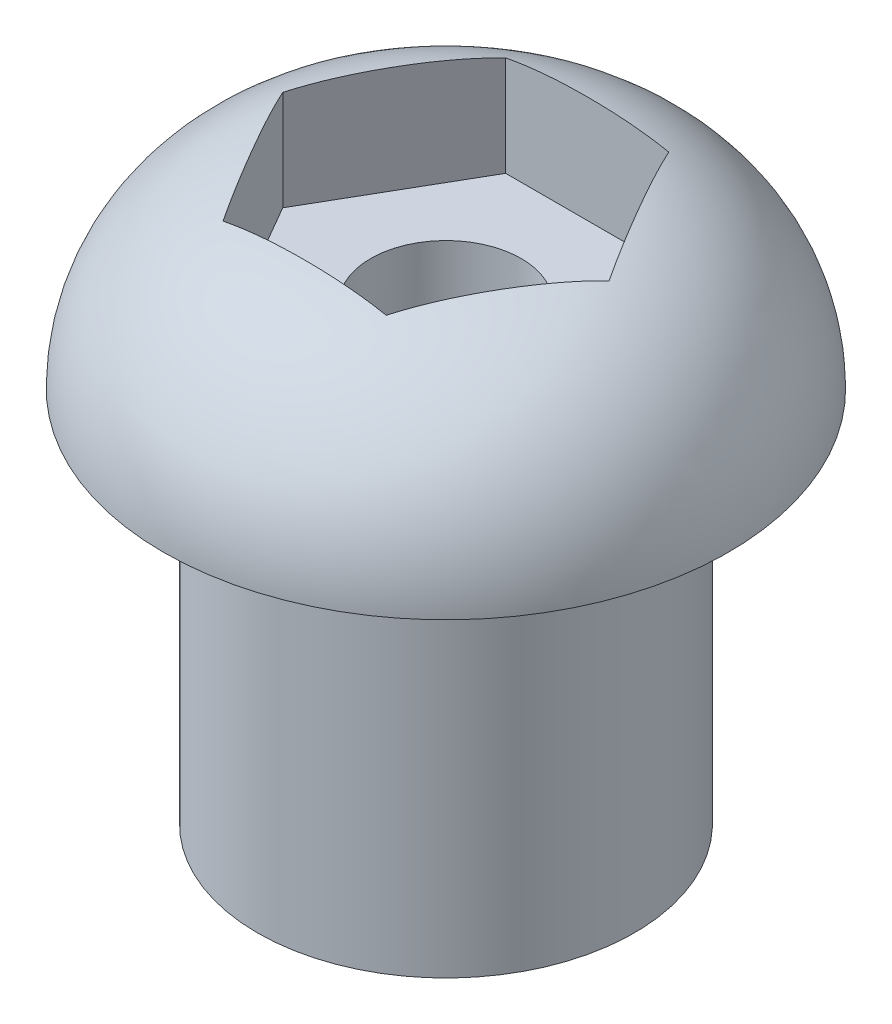
ISO-10303-21;
HEADER;
FILE_DESCRIPTION(('STEP AP214'),'2;1');
FILE_NAME('part.step','',(''),(''),'','','');
FILE_SCHEMA(('AUTOMOTIVE_DESIGN { 1 0 10303 214 1 1 1 1 }'));
ENDSEC;
DATA;
#1=APPLICATION_CONTEXT('core data for automotive mechanical design processes');
#2=APPLICATION_PROTOCOL_DEFINITION('international standard','automotive_design',2000,#1);
#3=PRODUCT_CONTEXT('',#1,'mechanical');
#4=PRODUCT('Part','Part','',(#3));
#5=PRODUCT_RELATED_PRODUCT_CATEGORY('part','',(#4));
#6=PRODUCT_DEFINITION_FORMATION('','',#4);
#7=PRODUCT_DEFINITION_CONTEXT('part definition',#1,'design');
#8=PRODUCT_DEFINITION('design','',#6,#7);
#9=PRODUCT_DEFINITION_SHAPE('','',#8);
#10=(LENGTH_UNIT() NAMED_UNIT(*) SI_UNIT(.MILLI.,.METRE.));
#11=(NAMED_UNIT(*) PLANE_ANGLE_UNIT() SI_UNIT($,.RADIAN.));
#12=(NAMED_UNIT(*) SI_UNIT($,.STERADIAN.) SOLID_ANGLE_UNIT());
#13=UNCERTAINTY_MEASURE_WITH_UNIT(LENGTH_MEASURE(1.E-05),#10,'distance_accuracy_value','');
#14=(GEOMETRIC_REPRESENTATION_CONTEXT(3) GLOBAL_UNCERTAINTY_ASSIGNED_CONTEXT((#13)) GLOBAL_UNIT_ASSIGNED_CONTEXT((#10,
#11,#12)) REPRESENTATION_CONTEXT('',''));
#15=CARTESIAN_POINT('',(0.,0.,0.));
#16=DIRECTION('',(0.,0.,1.));
#17=DIRECTION('',(1.,0.,0.));
#18=AXIS2_PLACEMENT_3D('',#15,#16,#17);
#19=CARTESIAN_POINT('',(0.,-0.00100000000000013,0.));
#20=DIRECTION('',(0.,1.,0.));
#21=DIRECTION('',(0.,0.,1.));
#22=AXIS2_PLACEMENT_3D('',#19,#20,#21);
#23=CYLINDRICAL_SURFACE('',#22,1.27);
#24=CARTESIAN_POINT('',(0.,7.62,0.));
#25=DIRECTION('',(0.,1.,0.));
#26=DIRECTION('',(0.,0.,1.));
#27=AXIS2_PLACEMENT_3D('',#24,#25,#26);
#28=CIRCLE('',#27,1.27);
#29=CARTESIAN_POINT('',(0.,7.62,1.27));
#30=VERTEX_POINT('',#29);
#31=EDGE_CURVE('E129',#30,#30,#28,.T.);
#32=ORIENTED_EDGE('',*,*,#31,.T.);
#33=EDGE_LOOP('',(#32));
#34=FACE_BOUND('',#33,.T.);
#35=CARTESIAN_POINT('',(0.,6.35,0.));
#36=DIRECTION('',(0.,-1.,0.));
#37=DIRECTION('',(0.,0.,-1.));
#38=AXIS2_PLACEMENT_3D('',#35,#36,#37);
#39=CIRCLE('',#38,1.27);
#40=CARTESIAN_POINT('',(0.,6.35,-1.27));
#41=VERTEX_POINT('',#40);
#42=EDGE_CURVE('E133',#41,#41,#39,.F.);
#43=ORIENTED_EDGE('',*,*,#42,.F.);
#44=EDGE_LOOP('',(#43));
#45=FACE_BOUND('',#44,.T.);
#46=ADVANCED_FACE('F39',(#34,#45),#23,.F.);
#47=CARTESIAN_POINT('',(0.,0.,0.));
#48=DIRECTION('',(0.,-1.,0.));
#49=DIRECTION('',(0.,0.,-1.));
#50=AXIS2_PLACEMENT_3D('',#47,#48,#49);
#51=PLANE('',#50);
#52=CARTESIAN_POINT('',(0.,0.,0.));
#53=DIRECTION('',(0.,-1.,0.));
#54=DIRECTION('',(0.,0.,-1.));
#55=AXIS2_PLACEMENT_3D('',#52,#53,#54);
#56=CIRCLE('',#55,2.3495);
#57=CARTESIAN_POINT('',(0.,0.,-2.3495));
#58=VERTEX_POINT('',#57);
#59=EDGE_CURVE('E222',#58,#58,#56,.T.);
#60=ORIENTED_EDGE('',*,*,#59,.F.);
#61=EDGE_LOOP('',(#60));
#62=FACE_BOUND('',#61,.T.);
#63=CARTESIAN_POINT('',(0.,0.,0.));
#64=DIRECTION('',(0.,1.,0.));
#65=DIRECTION('',(0.,0.,1.));
#66=AXIS2_PLACEMENT_3D('',#63,#64,#65);
#67=CIRCLE('',#66,3.175);
#68=CARTESIAN_POINT('',(0.,0.,3.175));
#69=VERTEX_POINT('',#68);
#70=EDGE_CURVE('E171',#69,#69,#67,.T.);
#71=ORIENTED_EDGE('',*,*,#70,.F.);
#72=EDGE_LOOP('',(#71));
#73=FACE_BOUND('',#72,.T.);
#74=ADVANCED_FACE('F210',(#62,#73),#51,.T.);
#75=CARTESIAN_POINT('',(0.,9.525,0.));
#76=DIRECTION('',(0.,1.,0.));
#77=DIRECTION('',(0.,0.,1.));
#78=AXIS2_PLACEMENT_3D('',#75,#76,#77);
#79=CYLINDRICAL_SURFACE('',#78,3.175);
#80=ORIENTED_EDGE('',*,*,#70,.T.);
#81=EDGE_LOOP('',(#80));
#82=FACE_BOUND('',#81,.T.);
#83=CARTESIAN_POINT('',(0.,6.35,0.));
#84=DIRECTION('',(0.,1.,0.));
#85=DIRECTION('',(0.,0.,1.));
#86=AXIS2_PLACEMENT_3D('',#83,#84,#85);
#87=CIRCLE('',#86,3.175);
#88=CARTESIAN_POINT('',(0.,6.35,3.175));
#89=VERTEX_POINT('',#88);
#90=EDGE_CURVE('E167',#89,#89,#87,.T.);
#91=ORIENTED_EDGE('',*,*,#90,.F.);
#92=EDGE_LOOP('',(#91));
#93=FACE_BOUND('',#92,.T.);
#94=ADVANCED_FACE('F207',(#82,#93),#79,.T.);
#95=CARTESIAN_POINT('',(-3.175,6.35,0.));
#96=DIRECTION('',(0.,-1.,0.));
#97=DIRECTION('',(0.,0.,-1.));
#98=AXIS2_PLACEMENT_3D('',#95,#96,#97);
#99=PLANE('',#98);
#100=ORIENTED_EDGE('',*,*,#90,.T.);
#101=EDGE_LOOP('',(#100));
#102=FACE_BOUND('',#101,.T.);
#103=CARTESIAN_POINT('',(0.,6.35,0.));
#104=DIRECTION('',(0.,1.,0.));
#105=DIRECTION('',(0.,0.,1.));
#106=AXIS2_PLACEMENT_3D('',#103,#104,#105);
#107=CIRCLE('',#106,4.7625);
#108=CARTESIAN_POINT('',(0.,6.35,4.7625));
#109=VERTEX_POINT('',#108);
#110=EDGE_CURVE('E151',#109,#109,#107,.T.);
#111=ORIENTED_EDGE('',*,*,#110,.F.);
#112=EDGE_LOOP('',(#111));
#113=FACE_BOUND('',#112,.T.);
#114=ADVANCED_FACE('F204',(#102,#113),#99,.T.);
#115=CARTESIAN_POINT('',(-2.74963065701559,7.62,0.));
#116=DIRECTION('',(-0.866025403784439,0.,0.5));
#117=DIRECTION('',(0.5,0.,0.866025403784439));
#118=AXIS2_PLACEMENT_3D('',#115,#116,#117);
#119=PLANE('',#118);
#120=DIRECTION('',(0.,1.,0.));
#121=VECTOR('',#120,1.);
#122=CARTESIAN_POINT('',(-2.74963065701559,7.62,0.));
#123=LINE('',#122,#121);
#124=CARTESIAN_POINT('',(-2.74963065701559,7.62,0.));
#125=VERTEX_POINT('',#124);
#126=CARTESIAN_POINT('',(-2.74963065701559,9.30467042764916,0.));
#127=VERTEX_POINT('',#126);
#128=EDGE_CURVE('E148',#125,#127,#123,.T.);
#129=ORIENTED_EDGE('',*,*,#128,.T.);
#130=CARTESIAN_POINT('',(-2.74963065701559,9.30467042764916,0.));
#131=CARTESIAN_POINT('',(-2.69983650051503,9.32424577853129,0.0862460089790142));
#132=CARTESIAN_POINT('',(-2.64977814172167,9.34089296862053,0.172949629752614));
#133=CARTESIAN_POINT('',(-2.54933659492492,9.36908457925064,0.346919491995405));
#134=CARTESIAN_POINT('',(-2.49895366491992,9.38063264173987,0.434185286598247));
#135=CARTESIAN_POINT('',(-2.39789827457541,9.39942332396034,0.609218357053648));
#136=CARTESIAN_POINT('',(-2.34722544477234,9.40665766638473,0.696986272835847));
#137=CARTESIAN_POINT('',(-2.24577245890099,9.41739842228163,0.872707998944596));
#138=CARTESIAN_POINT('',(-2.19499228211972,9.42090403477898,0.960661845147089));
#139=CARTESIAN_POINT('',(-2.09419234443931,9.42450669982096,1.13525245860933));
#140=CARTESIAN_POINT('',(-2.04417302673432,9.42465586299059,1.22188845823431));
#141=CARTESIAN_POINT('',(-1.94415757903064,9.42169266787663,1.39512029519882));
#142=CARTESIAN_POINT('',(-1.89416144893572,9.41858032325193,1.48171613270505));
#143=CARTESIAN_POINT('',(-1.79430030509016,9.40879452465003,1.65468070754751));
#144=CARTESIAN_POINT('',(-1.74443521344388,9.40212431222049,1.74104957980294));
#145=CARTESIAN_POINT('',(-1.64488668149314,9.38466547654602,1.91347269496051));
#146=CARTESIAN_POINT('',(-1.5952032089078,9.37387762508842,1.99952699377478));
#147=CARTESIAN_POINT('',(-1.53139418059526,9.35686849775808,2.1100474727937));
#148=CARTESIAN_POINT('',(-1.5171178733202,9.35285844231328,2.13477476233858));
#149=CARTESIAN_POINT('',(-1.48859719135471,9.34441831529121,2.18417403256932));
#150=CARTESIAN_POINT('',(-1.47435281438049,9.33998827480246,2.20884601721083));
#151=CARTESIAN_POINT('',(-1.4458692579818,9.33068007760417,2.2581809840736));
#152=CARTESIAN_POINT('',(-1.43163015549009,9.32580097848208,2.28284383304343));
#153=CARTESIAN_POINT('',(-1.40319140451912,9.3155841286895,2.33210119462895));
#154=CARTESIAN_POINT('',(-1.38899176099391,9.31024632289609,2.35669569866398));
#155=CARTESIAN_POINT('',(-1.37481532850779,9.30467042764921,2.38125));
#156=B_SPLINE_CURVE_WITH_KNOTS('',3,(#130,#131,#132,#133,#134,#135,#136,#137,#138,#139,#140,
#141,#142,#143,#144,#145,#146,#147,#148,#149,#150,#151,#152,#153,#154,#155),.UNSPECIFIED.,.F.,
.F.,(4,2,2,2,2,2,2,2,2,2,2,2,4),(0.,0.304371463013576,0.60852518185827,0.913260658234729,
1.21806158217225,1.51812699168352,1.818191144553,2.11798237694359,2.41771744570687,
2.50421378726651,2.59070373110363,2.67737951554782,2.76406573045136),.UNSPECIFIED.);
#157=CARTESIAN_POINT('',(-1.3748153285078,9.30467042764916,2.38125));
#158=VERTEX_POINT('',#157);
#159=EDGE_CURVE('E11',#127,#158,#156,.T.);
#160=ORIENTED_EDGE('',*,*,#159,.T.);
#161=DIRECTION('',(0.,1.,0.));
#162=VECTOR('',#161,1.);
#163=CARTESIAN_POINT('',(-1.3748153285078,7.62,2.38125));
#164=LINE('',#163,#162);
#165=CARTESIAN_POINT('',(-1.3748153285078,7.62,2.38125));
#166=VERTEX_POINT('',#165);
#167=EDGE_CURVE('E101',#166,#158,#164,.T.);
#168=ORIENTED_EDGE('',*,*,#167,.F.);
#169=DIRECTION('',(0.5,0.,0.866025403784439));
#170=VECTOR('',#169,1.);
#171=CARTESIAN_POINT('',(-2.74963065701559,7.62,0.));
#172=LINE('',#171,#170);
#173=EDGE_CURVE('E105',#125,#166,#172,.T.);
#174=ORIENTED_EDGE('',*,*,#173,.F.);
#175=EDGE_LOOP('',(#129,#160,#168,#174));
#176=FACE_BOUND('',#175,.T.);
#177=ADVANCED_FACE('F103',(#176),#119,.F.);
#178=CARTESIAN_POINT('',(-1.3748153285078,7.62,-2.38125));
#179=DIRECTION('',(-0.866025403784439,0.,-0.5));
#180=DIRECTION('',(-0.5,0.,0.866025403784439));
#181=AXIS2_PLACEMENT_3D('',#178,#179,#180);
#182=PLANE('',#181);
#183=DIRECTION('',(0.,1.,0.));
#184=VECTOR('',#183,1.);
#185=CARTESIAN_POINT('',(-1.3748153285078,7.62,-2.38125));
#186=LINE('',#185,#184);
#187=CARTESIAN_POINT('',(-1.3748153285078,7.62,-2.38125));
#188=VERTEX_POINT('',#187);
#189=CARTESIAN_POINT('',(-1.3748153285078,9.30467042764916,-2.38125));
#190=VERTEX_POINT('',#189);
#191=EDGE_CURVE('E152',#188,#190,#186,.T.);
#192=ORIENTED_EDGE('',*,*,#191,.T.);
#193=CARTESIAN_POINT('',(-1.3748153285078,9.30467042764916,-2.38125));
#194=CARTESIAN_POINT('',(-1.42460948500836,9.32424577853129,-2.29500399102099));
#195=CARTESIAN_POINT('',(-1.47466784380171,9.34089296862053,-2.20830037024739));
#196=CARTESIAN_POINT('',(-1.57510939059847,9.36908457925064,-2.0343305080046));
#197=CARTESIAN_POINT('',(-1.62549232060347,9.38063264173987,-1.94706471340175));
#198=CARTESIAN_POINT('',(-1.72654771094798,9.39942332396034,-1.77203164294635));
#199=CARTESIAN_POINT('',(-1.77722054075105,9.40665766638473,-1.68426372716415));
#200=CARTESIAN_POINT('',(-1.8786735266224,9.41739842228163,-1.50854200105541));
#201=CARTESIAN_POINT('',(-1.92945370340367,9.42090403477898,-1.42058815485291));
#202=CARTESIAN_POINT('',(-2.03025364108408,9.42450669982096,-1.24599754139067));
#203=CARTESIAN_POINT('',(-2.08027295878907,9.42465586299059,-1.15936154176569));
#204=CARTESIAN_POINT('',(-2.18028840649275,9.42169266787663,-0.986129704801176));
#205=CARTESIAN_POINT('',(-2.23028453658767,9.41858032325193,-0.899533867294956));
#206=CARTESIAN_POINT('',(-2.33014568043323,9.40879452465003,-0.726569292452492));
#207=CARTESIAN_POINT('',(-2.38001077207951,9.40212431222049,-0.640200420197063));
#208=CARTESIAN_POINT('',(-2.47955930403024,9.38466547654602,-0.467777305039493));
#209=CARTESIAN_POINT('',(-2.52924277661559,9.37387762508842,-0.38172300622522));
#210=CARTESIAN_POINT('',(-2.59305180492813,9.35686849775808,-0.271202527206305));
#211=CARTESIAN_POINT('',(-2.60732811220319,9.35285844231328,-0.246475237661425));
#212=CARTESIAN_POINT('',(-2.63584879416868,9.34441831529121,-0.197075967430685));
#213=CARTESIAN_POINT('',(-2.6500931711429,9.33998827480246,-0.17240398278917));
#214=CARTESIAN_POINT('',(-2.67857672754158,9.33068007760417,-0.123069015926399));
#215=CARTESIAN_POINT('',(-2.6928158300333,9.32580097848208,-0.0984061669565705));
#216=CARTESIAN_POINT('',(-2.72125458100427,9.3155841286895,-0.0491488053710482));
#217=CARTESIAN_POINT('',(-2.73545422452948,9.31024632289609,-0.0245543013360217));
#218=CARTESIAN_POINT('',(-2.7496306570156,9.30467042764921,0.));
#219=B_SPLINE_CURVE_WITH_KNOTS('',3,(#193,#194,#195,#196,#197,#198,#199,#200,#201,#202,#203,
#204,#205,#206,#207,#208,#209,#210,#211,#212,#213,#214,#215,#216,#217,#218),.UNSPECIFIED.,.F.,
.F.,(4,2,2,2,2,2,2,2,2,2,2,2,4),(0.,0.304371463013576,0.608525181858269,0.913260658234728,
1.21806158217225,1.51812699168352,1.818191144553,2.11798237694358,2.41771744570687,
2.50421378726651,2.59070373110363,2.67737951554782,2.76406573045136),.UNSPECIFIED.);
#220=EDGE_CURVE('E54',#190,#127,#219,.T.);
#221=ORIENTED_EDGE('',*,*,#220,.T.);
#222=ORIENTED_EDGE('',*,*,#128,.F.);
#223=DIRECTION('',(-0.5,0.,0.866025403784439));
#224=VECTOR('',#223,1.);
#225=CARTESIAN_POINT('',(-1.3748153285078,7.62,-2.38125));
#226=LINE('',#225,#224);
#227=EDGE_CURVE('E112',#188,#125,#226,.T.);
#228=ORIENTED_EDGE('',*,*,#227,.F.);
#229=EDGE_LOOP('',(#192,#221,#222,#228));
#230=FACE_BOUND('',#229,.T.);
#231=ADVANCED_FACE('F203',(#230),#182,.F.);
#232=CARTESIAN_POINT('',(1.3748153285078,7.62,-2.38125));
#233=DIRECTION('',(0.,0.,-1.));
#234=DIRECTION('',(-1.,0.,0.));
#235=AXIS2_PLACEMENT_3D('',#232,#233,#234);
#236=PLANE('',#235);
#237=DIRECTION('',(0.,1.,0.));
#238=VECTOR('',#237,1.);
#239=CARTESIAN_POINT('',(1.3748153285078,7.62,-2.38125));
#240=LINE('',#239,#238);
#241=CARTESIAN_POINT('',(1.3748153285078,7.62,-2.38125));
#242=VERTEX_POINT('',#241);
#243=CARTESIAN_POINT('',(1.3748153285078,9.30467042764916,-2.38125));
#244=VERTEX_POINT('',#243);
#245=EDGE_CURVE('E155',#242,#244,#240,.T.);
#246=ORIENTED_EDGE('',*,*,#245,.T.);
#247=CARTESIAN_POINT('',(1.3748153285078,9.30467042764916,-2.38125));
#248=CARTESIAN_POINT('',(1.27522701550666,9.32424577853129,-2.38125));
#249=CARTESIAN_POINT('',(1.17511029791996,9.34089296862053,-2.38125));
#250=CARTESIAN_POINT('',(0.974227204326445,9.36908457925064,-2.38125));
#251=CARTESIAN_POINT('',(0.873461344316449,9.38063264173987,-2.38125));
#252=CARTESIAN_POINT('',(0.671350563627425,9.39942332396034,-2.38125));
#253=CARTESIAN_POINT('',(0.570004904021295,9.40665766638473,-2.38125));
#254=CARTESIAN_POINT('',(0.367098932278591,9.41739842228163,-2.38125));
#255=CARTESIAN_POINT('',(0.265538578716046,9.42090403477898,-2.38125));
#256=CARTESIAN_POINT('',(0.0639387033552277,9.42450669982096,-2.38125));
#257=CARTESIAN_POINT('',(-0.0360999320547533,9.42465586299059,-2.38125));
#258=CARTESIAN_POINT('',(-0.236130827462109,9.42169266787662,-2.38125));
#259=CARTESIAN_POINT('',(-0.336123087651944,9.41858032325193,-2.38125));
#260=CARTESIAN_POINT('',(-0.535845375343076,9.40879452465003,-2.38125));
#261=CARTESIAN_POINT('',(-0.635575558635629,9.40212431222049,-2.38125));
#262=CARTESIAN_POINT('',(-0.834672622537103,9.38466547654602,-2.38125));
#263=CARTESIAN_POINT('',(-0.934039567707793,9.37387762508842,-2.38125));
#264=CARTESIAN_POINT('',(-1.06165762433287,9.35686849775808,-2.38125));
#265=CARTESIAN_POINT('',(-1.090210238883,9.35285844231328,-2.38125));
#266=CARTESIAN_POINT('',(-1.14725160281398,9.34441831529121,-2.38125));
#267=CARTESIAN_POINT('',(-1.17574035676242,9.33998827480246,-2.38125));
#268=CARTESIAN_POINT('',(-1.23270746955978,9.33068007760417,-2.38125));
#269=CARTESIAN_POINT('',(-1.26118567454321,9.32580097848208,-2.38125));
#270=CARTESIAN_POINT('',(-1.31806317648515,9.3155841286895,-2.38125));
#271=CARTESIAN_POINT('',(-1.34646246353557,9.31024632289609,-2.38125));
#272=CARTESIAN_POINT('',(-1.3748153285078,9.30467042764921,-2.38125));
#273=B_SPLINE_CURVE_WITH_KNOTS('',3,(#247,#248,#249,#250,#251,#252,#253,#254,#255,#256,#257,
#258,#259,#260,#261,#262,#263,#264,#265,#266,#267,#268,#269,#270,#271,#272),.UNSPECIFIED.,.F.,
.F.,(4,2,2,2,2,2,2,2,2,2,2,2,4),(0.,0.304371463013575,0.608525181858269,0.913260658234729,
1.21806158217225,1.51812699168352,1.818191144553,2.11798237694359,2.41771744570687,
2.50421378726651,2.59070373110363,2.67737951554782,2.76406573045136),.UNSPECIFIED.);
#274=EDGE_CURVE('E68',#244,#190,#273,.T.);
#275=ORIENTED_EDGE('',*,*,#274,.T.);
#276=ORIENTED_EDGE('',*,*,#191,.F.);
#277=DIRECTION('',(-1.,0.,0.));
#278=VECTOR('',#277,1.);
#279=CARTESIAN_POINT('',(1.3748153285078,7.62,-2.38125));
#280=LINE('',#279,#278);
#281=EDGE_CURVE('E143',#242,#188,#280,.T.);
#282=ORIENTED_EDGE('',*,*,#281,.F.);
#283=EDGE_LOOP('',(#246,#275,#276,#282));
#284=FACE_BOUND('',#283,.T.);
#285=ADVANCED_FACE('F243',(#284),#236,.F.);
#286=CARTESIAN_POINT('',(2.74963065701559,7.62,0.));
#287=DIRECTION('',(0.866025403784439,0.,-0.5));
#288=DIRECTION('',(-0.5,0.,-0.866025403784439));
#289=AXIS2_PLACEMENT_3D('',#286,#287,#288);
#290=PLANE('',#289);
#291=DIRECTION('',(0.,1.,0.));
#292=VECTOR('',#291,1.);
#293=CARTESIAN_POINT('',(2.74963065701559,7.62,0.));
#294=LINE('',#293,#292);
#295=CARTESIAN_POINT('',(2.74963065701559,7.62,0.));
#296=VERTEX_POINT('',#295);
#297=CARTESIAN_POINT('',(2.74963065701559,9.30467042764916,0.));
#298=VERTEX_POINT('',#297);
#299=EDGE_CURVE('E158',#296,#298,#294,.T.);
#300=ORIENTED_EDGE('',*,*,#299,.T.);
#301=CARTESIAN_POINT('',(2.74963065701559,9.30467042764916,0.));
#302=CARTESIAN_POINT('',(2.69983650051503,9.32424577853129,-0.086246008979015));
#303=CARTESIAN_POINT('',(2.64977814172167,9.34089296862054,-0.172949629752615));
#304=CARTESIAN_POINT('',(2.54933659492492,9.36908457925065,-0.346919491995405));
#305=CARTESIAN_POINT('',(2.49895366491992,9.38063264173987,-0.434185286598248));
#306=CARTESIAN_POINT('',(2.39789827457541,9.39942332396034,-0.609218357053648));
#307=CARTESIAN_POINT('',(2.34722544477234,9.40665766638473,-0.696986272835847));
#308=CARTESIAN_POINT('',(2.24577245890099,9.41739842228163,-0.872707998944596));
#309=CARTESIAN_POINT('',(2.19499228211972,9.42090403477898,-0.960661845147089));
#310=CARTESIAN_POINT('',(2.09419234443931,9.42450669982096,-1.13525245860933));
#311=CARTESIAN_POINT('',(2.04417302673432,9.42465586299059,-1.22188845823431));
#312=CARTESIAN_POINT('',(1.94415757903064,9.42169266787663,-1.39512029519883));
#313=CARTESIAN_POINT('',(1.89416144893572,9.41858032325193,-1.48171613270505));
#314=CARTESIAN_POINT('',(1.79430030509016,9.40879452465003,-1.65468070754751));
#315=CARTESIAN_POINT('',(1.74443521344388,9.40212431222049,-1.74104957980294));
#316=CARTESIAN_POINT('',(1.64488668149314,9.38466547654602,-1.91347269496051));
#317=CARTESIAN_POINT('',(1.5952032089078,9.37387762508842,-1.99952699377478));
#318=CARTESIAN_POINT('',(1.53139418059526,9.35686849775808,-2.1100474727937));
#319=CARTESIAN_POINT('',(1.5171178733202,9.35285844231328,-2.13477476233858));
#320=CARTESIAN_POINT('',(1.48859719135471,9.34441831529121,-2.18417403256932));
#321=CARTESIAN_POINT('',(1.47435281438049,9.33998827480246,-2.20884601721083));
#322=CARTESIAN_POINT('',(1.4458692579818,9.33068007760417,-2.2581809840736));
#323=CARTESIAN_POINT('',(1.43163015549009,9.32580097848208,-2.28284383304343));
#324=CARTESIAN_POINT('',(1.40319140451912,9.3155841286895,-2.33210119462895));
#325=CARTESIAN_POINT('',(1.38899176099391,9.31024632289609,-2.35669569866398));
#326=CARTESIAN_POINT('',(1.37481532850779,9.30467042764921,-2.38125000000001));
#327=B_SPLINE_CURVE_WITH_KNOTS('',3,(#301,#302,#303,#304,#305,#306,#307,#308,#309,#310,#311,
#312,#313,#314,#315,#316,#317,#318,#319,#320,#321,#322,#323,#324,#325,#326),.UNSPECIFIED.,.F.,
.F.,(4,2,2,2,2,2,2,2,2,2,2,2,4),(0.,0.304371463013576,0.608525181858269,0.913260658234729,
1.21806158217225,1.51812699168352,1.818191144553,2.11798237694359,2.41771744570687,
2.50421378726651,2.59070373110363,2.67737951554782,2.76406573045136),.UNSPECIFIED.);
#328=EDGE_CURVE('E235',#298,#244,#327,.T.);
#329=ORIENTED_EDGE('',*,*,#328,.T.);
#330=ORIENTED_EDGE('',*,*,#245,.F.);
#331=DIRECTION('',(-0.5,0.,-0.866025403784439));
#332=VECTOR('',#331,1.);
#333=CARTESIAN_POINT('',(2.74963065701559,7.62,0.));
#334=LINE('',#333,#332);
#335=EDGE_CURVE('E139',#296,#242,#334,.T.);
#336=ORIENTED_EDGE('',*,*,#335,.F.);
#337=EDGE_LOOP('',(#300,#329,#330,#336));
#338=FACE_BOUND('',#337,.T.);
#339=ADVANCED_FACE('F242',(#338),#290,.F.);
#340=CARTESIAN_POINT('',(1.3748153285078,7.62,2.38125));
#341=DIRECTION('',(0.866025403784439,0.,0.5));
#342=DIRECTION('',(0.5,0.,-0.866025403784439));
#343=AXIS2_PLACEMENT_3D('',#340,#341,#342);
#344=PLANE('',#343);
#345=DIRECTION('',(0.,1.,0.));
#346=VECTOR('',#345,1.);
#347=CARTESIAN_POINT('',(1.3748153285078,7.62,2.38125));
#348=LINE('',#347,#346);
#349=CARTESIAN_POINT('',(1.3748153285078,7.62,2.38125));
#350=VERTEX_POINT('',#349);
#351=CARTESIAN_POINT('',(1.3748153285078,9.30467042764916,2.38125));
#352=VERTEX_POINT('',#351);
#353=EDGE_CURVE('E111',#350,#352,#348,.T.);
#354=ORIENTED_EDGE('',*,*,#353,.T.);
#355=CARTESIAN_POINT('',(1.3748153285078,9.30467042764916,2.38125));
#356=CARTESIAN_POINT('',(1.42460948500836,9.32424577853129,2.29500399102099));
#357=CARTESIAN_POINT('',(1.47466784380171,9.34089296862053,2.20830037024739));
#358=CARTESIAN_POINT('',(1.57510939059847,9.36908457925064,2.0343305080046));
#359=CARTESIAN_POINT('',(1.62549232060347,9.38063264173987,1.94706471340175));
#360=CARTESIAN_POINT('',(1.72654771094798,9.39942332396034,1.77203164294635));
#361=CARTESIAN_POINT('',(1.77722054075105,9.40665766638473,1.68426372716415));
#362=CARTESIAN_POINT('',(1.8786735266224,9.41739842228163,1.5085420010554));
#363=CARTESIAN_POINT('',(1.92945370340367,9.42090403477898,1.42058815485291));
#364=CARTESIAN_POINT('',(2.03025364108408,9.42450669982096,1.24599754139067));
#365=CARTESIAN_POINT('',(2.08027295878907,9.42465586299059,1.15936154176569));
#366=CARTESIAN_POINT('',(2.18028840649275,9.42169266787663,0.986129704801175));
#367=CARTESIAN_POINT('',(2.23028453658767,9.41858032325193,0.899533867294954));
#368=CARTESIAN_POINT('',(2.33014568043323,9.40879452465003,0.72656929245249));
#369=CARTESIAN_POINT('',(2.38001077207951,9.40212431222049,0.640200420197061));
#370=CARTESIAN_POINT('',(2.47955930403024,9.38466547654602,0.467777305039491));
#371=CARTESIAN_POINT('',(2.52924277661559,9.37387762508842,0.381723006225217));
#372=CARTESIAN_POINT('',(2.59305180492813,9.35686849775808,0.271202527206303));
#373=CARTESIAN_POINT('',(2.60732811220319,9.35285844231329,0.246475237661423));
#374=CARTESIAN_POINT('',(2.63584879416868,9.34441831529121,0.197075967430683));
#375=CARTESIAN_POINT('',(2.6500931711429,9.33998827480246,0.172403982789169));
#376=CARTESIAN_POINT('',(2.67857672754158,9.33068007760417,0.123069015926397));
#377=CARTESIAN_POINT('',(2.6928158300333,9.32580097848208,0.098406166956569));
#378=CARTESIAN_POINT('',(2.72125458100427,9.3155841286895,0.0491488053710469));
#379=CARTESIAN_POINT('',(2.73545422452948,9.31024632289609,0.0245543013360206));
#380=CARTESIAN_POINT('',(2.7496306570156,9.30467042764921,0.));
#381=B_SPLINE_CURVE_WITH_KNOTS('',3,(#355,#356,#357,#358,#359,#360,#361,#362,#363,#364,#365,
#366,#367,#368,#369,#370,#371,#372,#373,#374,#375,#376,#377,#378,#379,#380),.UNSPECIFIED.,.F.,
.F.,(4,2,2,2,2,2,2,2,2,2,2,2,4),(0.,0.304371463013575,0.608525181858269,0.913260658234729,
1.21806158217225,1.51812699168352,1.818191144553,2.11798237694359,2.41771744570687,
2.50421378726651,2.59070373110363,2.67737951554782,2.76406573045136),.UNSPECIFIED.);
#382=EDGE_CURVE('E234',#352,#298,#381,.T.);
#383=ORIENTED_EDGE('',*,*,#382,.T.);
#384=ORIENTED_EDGE('',*,*,#299,.F.);
#385=DIRECTION('',(0.5,0.,-0.866025403784439));
#386=VECTOR('',#385,1.);
#387=CARTESIAN_POINT('',(1.3748153285078,7.62,2.38125));
#388=LINE('',#387,#386);
#389=EDGE_CURVE('E123',#350,#296,#388,.T.);
#390=ORIENTED_EDGE('',*,*,#389,.F.);
#391=EDGE_LOOP('',(#354,#383,#384,#390));
#392=FACE_BOUND('',#391,.T.);
#393=ADVANCED_FACE('F196',(#392),#344,.F.);
#394=CARTESIAN_POINT('',(-1.3748153285078,7.62,2.38125));
#395=DIRECTION('',(0.,0.,1.));
#396=DIRECTION('',(1.,0.,0.));
#397=AXIS2_PLACEMENT_3D('',#394,#395,#396);
#398=PLANE('',#397);
#399=CARTESIAN_POINT('',(-1.3748153285078,9.30467042764916,2.38125));
#400=CARTESIAN_POINT('',(-1.26158776798488,9.32691797046628,2.38125));
#401=CARTESIAN_POINT('',(-1.1476957474661,9.34539020906031,2.38125));
#402=CARTESIAN_POINT('',(-0.919301345986093,9.37585291821077,2.38125));
#403=CARTESIAN_POINT('',(-0.804800946410438,9.38785805818703,2.38125));
#404=CARTESIAN_POINT('',(-0.575463621179614,9.40654056250761,2.38125));
#405=CARTESIAN_POINT('',(-0.460626965802301,9.41322141935924,2.38125));
#406=CARTESIAN_POINT('',(-0.288118016632326,9.41983407221535,2.38125));
#407=CARTESIAN_POINT('',(-0.230505185402991,9.4214700951926,2.38125));
#408=CARTESIAN_POINT('',(-0.11526187995973,9.42364075619584,2.38125));
#409=CARTESIAN_POINT('',(-0.0576314069181685,9.42417545606256,2.38125));
#410=CARTESIAN_POINT('',(0.,9.42418053105213,2.38125));
#411=B_SPLINE_CURVE_WITH_KNOTS('',3,(#399,#400,#401,#402,#403,#404,#405,#406,#407,#408,#409,
#410),.UNSPECIFIED.,.F.,.F.,(4,2,2,2,2,4),(0.,0.346003651109,0.69121911618043,1.0362079475116,
1.20910720873504,1.38199676117337),.UNSPECIFIED.);
#412=CARTESIAN_POINT('',(0.,9.42418053105213,2.38125));
#413=VERTEX_POINT('',#412);
#414=EDGE_CURVE('E175',#158,#413,#411,.T.);
#415=ORIENTED_EDGE('',*,*,#414,.T.);
#416=CARTESIAN_POINT('',(0.,9.42418053105213,2.38125));
#417=CARTESIAN_POINT('',(0.0576314069181674,9.42417545606256,2.38125));
#418=CARTESIAN_POINT('',(0.115261879959728,9.42364075619584,2.38125));
#419=CARTESIAN_POINT('',(0.23050518540299,9.4214700951926,2.38125));
#420=CARTESIAN_POINT('',(0.288118016632324,9.41983407221535,2.38125));
#421=CARTESIAN_POINT('',(0.460626965802299,9.41322141935924,2.38125));
#422=CARTESIAN_POINT('',(0.575463621179613,9.40654056250761,2.38125));
#423=CARTESIAN_POINT('',(0.804800946410438,9.38785805818703,2.38125));
#424=CARTESIAN_POINT('',(0.919301345986092,9.37585291821077,2.38125));
#425=CARTESIAN_POINT('',(1.1476957474661,9.34539020906031,2.38125));
#426=CARTESIAN_POINT('',(1.26158776798488,9.32691797046628,2.38125));
#427=CARTESIAN_POINT('',(1.3748153285078,9.30467042764916,2.38125));
#428=B_SPLINE_CURVE_WITH_KNOTS('',3,(#416,#417,#418,#419,#420,#421,#422,#423,#424,#425,#426,
#427),.UNSPECIFIED.,.F.,.F.,(4,2,2,2,2,4),(0.,0.172889552438333,0.345788813661775,
0.690777644992946,1.03599311006438,1.38199676117338),.UNSPECIFIED.);
#429=EDGE_CURVE('E187',#413,#352,#428,.T.);
#430=ORIENTED_EDGE('',*,*,#429,.T.);
#431=ORIENTED_EDGE('',*,*,#353,.F.);
#432=DIRECTION('',(1.,0.,0.));
#433=VECTOR('',#432,1.);
#434=CARTESIAN_POINT('',(-1.3748153285078,7.62,2.38125));
#435=LINE('',#434,#433);
#436=EDGE_CURVE('E115',#166,#350,#435,.T.);
#437=ORIENTED_EDGE('',*,*,#436,.F.);
#438=ORIENTED_EDGE('',*,*,#167,.T.);
#439=EDGE_LOOP('',(#415,#430,#431,#437,#438));
#440=FACE_BOUND('',#439,.T.);
#441=ADVANCED_FACE('F116',(#440),#398,.F.);
#442=CARTESIAN_POINT('',(0.,7.62,0.));
#443=DIRECTION('',(0.,1.,0.));
#444=DIRECTION('',(0.,0.,1.));
#445=AXIS2_PLACEMENT_3D('',#442,#443,#444);
#446=PLANE('',#445);
#447=ORIENTED_EDGE('',*,*,#31,.F.);
#448=EDGE_LOOP('',(#447));
#449=FACE_BOUND('',#448,.T.);
#450=ORIENTED_EDGE('',*,*,#173,.T.);
#451=ORIENTED_EDGE('',*,*,#436,.T.);
#452=ORIENTED_EDGE('',*,*,#389,.T.);
#453=ORIENTED_EDGE('',*,*,#335,.T.);
#454=ORIENTED_EDGE('',*,*,#281,.T.);
#455=ORIENTED_EDGE('',*,*,#227,.T.);
#456=EDGE_LOOP('',(#450,#451,#452,#453,#454,#455));
#457=FACE_BOUND('',#456,.T.);
#458=ADVANCED_FACE('F125',(#449,#457),#446,.T.);
#459=CARTESIAN_POINT('',(-3.175,6.35,0.));
#460=DIRECTION('',(0.,-1.,0.));
#461=DIRECTION('',(0.,0.,-1.));
#462=AXIS2_PLACEMENT_3D('',#459,#460,#461);
#463=PLANE('',#462);
#464=CARTESIAN_POINT('',(0.,6.35,0.));
#465=DIRECTION('',(0.,-1.,0.));
#466=DIRECTION('',(0.,0.,-1.));
#467=AXIS2_PLACEMENT_3D('',#464,#465,#466);
#468=CIRCLE('',#467,2.3495);
#469=CARTESIAN_POINT('',(0.,6.35,-2.3495));
#470=VERTEX_POINT('',#469);
#471=EDGE_CURVE('E179',#470,#470,#468,.F.);
#472=ORIENTED_EDGE('',*,*,#471,.F.);
#473=EDGE_LOOP('',(#472));
#474=FACE_BOUND('',#473,.T.);
#475=ORIENTED_EDGE('',*,*,#42,.T.);
#476=EDGE_LOOP('',(#475));
#477=FACE_BOUND('',#476,.T.);
#478=ADVANCED_FACE('F290',(#474,#477),#463,.T.);
#479=CARTESIAN_POINT('',(0.,12.9953895295912,0.));
#480=DIRECTION('',(0.,-1.,0.));
#481=DIRECTION('',(0.,0.,-1.));
#482=AXIS2_PLACEMENT_3D('',#479,#480,#481);
#483=CYLINDRICAL_SURFACE('',#482,2.3495);
#484=ORIENTED_EDGE('',*,*,#471,.T.);
#485=EDGE_LOOP('',(#484));
#486=FACE_BOUND('',#485,.T.);
#487=ORIENTED_EDGE('',*,*,#59,.T.);
#488=EDGE_LOOP('',(#487));
#489=FACE_BOUND('',#488,.T.);
#490=ADVANCED_FACE('F231',(#486,#489),#483,.F.);
#491=CARTESIAN_POINT('',(0.,6.35,0.));
#492=DIRECTION('',(0.,1.,0.));
#493=DIRECTION('',(0.,0.,1.));
#494=AXIS2_PLACEMENT_3D('',#491,#492,#493);
#495=DEGENERATE_TOROIDAL_SURFACE('',#494,1.5875,3.175,.T.);
#496=ORIENTED_EDGE('',*,*,#110,.T.);
#497=EDGE_LOOP('',(#496));
#498=FACE_BOUND('',#497,.T.);
#499=ORIENTED_EDGE('',*,*,#382,.F.);
#500=ORIENTED_EDGE('',*,*,#429,.F.);
#501=ORIENTED_EDGE('',*,*,#414,.F.);
#502=ORIENTED_EDGE('',*,*,#159,.F.);
#503=ORIENTED_EDGE('',*,*,#220,.F.);
#504=ORIENTED_EDGE('',*,*,#274,.F.);
#505=ORIENTED_EDGE('',*,*,#328,.F.);
#506=EDGE_LOOP('',(#499,#500,#501,#502,#503,#504,#505));
#507=FACE_BOUND('',#506,.T.);
#508=ADVANCED_FACE('F41',(#498,#507),#495,.T.);
#509=CLOSED_SHELL('',(#46,#74,#94,#114,#177,#231,#285,#339,#393,#441,#458,#478,#490,#508));
#510=MANIFOLD_SOLID_BREP('B2',#509);
#511=ADVANCED_BREP_SHAPE_REPRESENTATION('',(#18,#510),#14);
#512=SHAPE_DEFINITION_REPRESENTATION(#9,#511);
ENDSEC;
END-ISO-10303-21;
